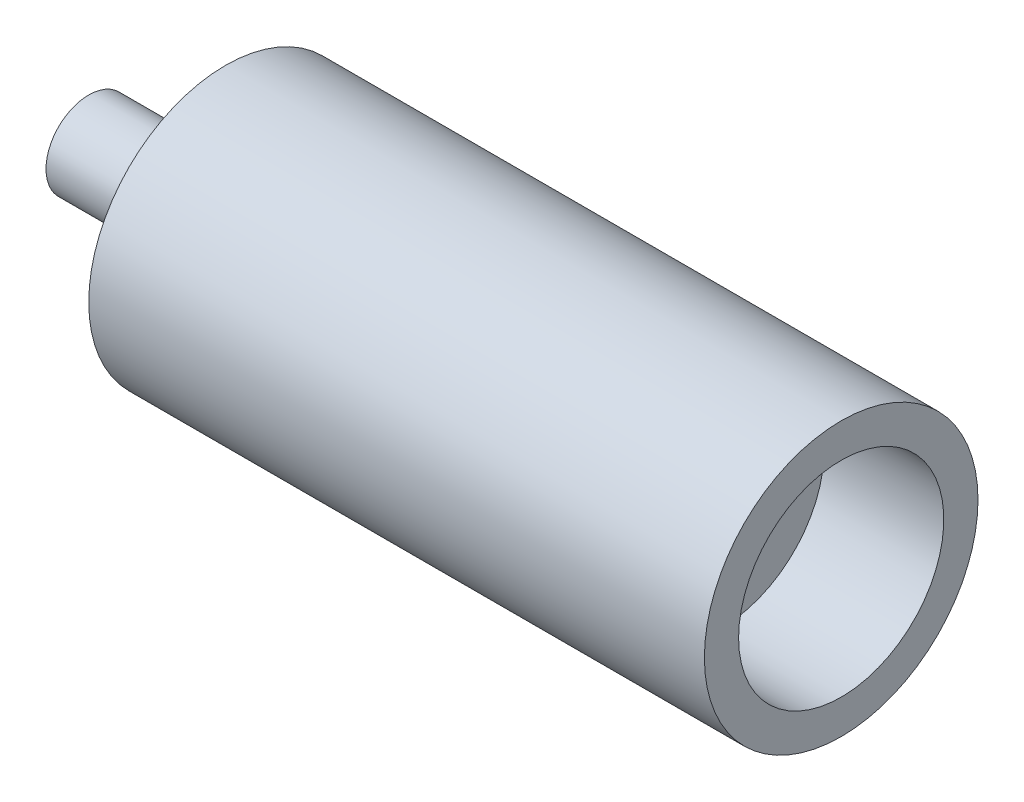
ISO-10303-21;
HEADER;
FILE_DESCRIPTION(('STEP AP214'),'2;1');
FILE_NAME('part.step','',(''),(''),'','','');
FILE_SCHEMA(('AUTOMOTIVE_DESIGN { 1 0 10303 214 1 1 1 1 }'));
ENDSEC;
DATA;
#1=APPLICATION_CONTEXT('core data for automotive mechanical design processes');
#2=APPLICATION_PROTOCOL_DEFINITION('international standard','automotive_design',2000,#1);
#3=PRODUCT_CONTEXT('',#1,'mechanical');
#4=PRODUCT('Part','Part','',(#3));
#5=PRODUCT_RELATED_PRODUCT_CATEGORY('part','',(#4));
#6=PRODUCT_DEFINITION_FORMATION('','',#4);
#7=PRODUCT_DEFINITION_CONTEXT('part definition',#1,'design');
#8=PRODUCT_DEFINITION('design','',#6,#7);
#9=PRODUCT_DEFINITION_SHAPE('','',#8);
#10=(LENGTH_UNIT() NAMED_UNIT(*) SI_UNIT(.MILLI.,.METRE.));
#11=(NAMED_UNIT(*) PLANE_ANGLE_UNIT() SI_UNIT($,.RADIAN.));
#12=(NAMED_UNIT(*) SI_UNIT($,.STERADIAN.) SOLID_ANGLE_UNIT());
#13=UNCERTAINTY_MEASURE_WITH_UNIT(LENGTH_MEASURE(1.E-05),#10,'distance_accuracy_value','');
#14=(GEOMETRIC_REPRESENTATION_CONTEXT(3) GLOBAL_UNCERTAINTY_ASSIGNED_CONTEXT((#13)) GLOBAL_UNIT_ASSIGNED_CONTEXT((#10,
#11,#12)) REPRESENTATION_CONTEXT('',''));
#15=CARTESIAN_POINT('',(0.,0.,0.));
#16=DIRECTION('',(0.,0.,1.));
#17=DIRECTION('',(1.,0.,0.));
#18=AXIS2_PLACEMENT_3D('',#15,#16,#17);
#19=CARTESIAN_POINT('',(0.,0.,0.));
#20=DIRECTION('',(1.,0.,0.));
#21=DIRECTION('',(0.,0.,-1.));
#22=AXIS2_PLACEMENT_3D('',#19,#20,#21);
#23=PLANE('',#22);
#24=CARTESIAN_POINT('',(0.,0.,0.));
#25=DIRECTION('',(-1.,0.,0.));
#26=DIRECTION('',(0.,0.,1.));
#27=AXIS2_PLACEMENT_3D('',#24,#25,#26);
#28=CIRCLE('',#27,12.5);
#29=CARTESIAN_POINT('',(0.,0.,12.5));
#30=VERTEX_POINT('',#29);
#31=EDGE_CURVE('E10',#30,#30,#28,.T.);
#32=ORIENTED_EDGE('',*,*,#31,.T.);
#33=EDGE_LOOP('',(#32));
#34=FACE_BOUND('',#33,.T.);
#35=ADVANCED_FACE('F35',(#34),#23,.F.);
#36=CARTESIAN_POINT('',(37.7600807716813,0.,0.));
#37=DIRECTION('',(-1.,0.,0.));
#38=DIRECTION('',(0.,0.,1.));
#39=AXIS2_PLACEMENT_3D('',#36,#37,#38);
#40=CYLINDRICAL_SURFACE('',#39,12.5);
#41=ORIENTED_EDGE('',*,*,#31,.F.);
#42=EDGE_LOOP('',(#41));
#43=FACE_BOUND('',#42,.T.);
#44=CARTESIAN_POINT('',(30.,0.,0.));
#45=DIRECTION('',(-1.,0.,0.));
#46=DIRECTION('',(0.,0.,1.));
#47=AXIS2_PLACEMENT_3D('',#44,#45,#46);
#48=CIRCLE('',#47,12.5);
#49=CARTESIAN_POINT('',(30.,0.,12.5));
#50=VERTEX_POINT('',#49);
#51=EDGE_CURVE('E41',#50,#50,#48,.T.);
#52=ORIENTED_EDGE('',*,*,#51,.T.);
#53=EDGE_LOOP('',(#52));
#54=FACE_BOUND('',#53,.T.);
#55=ADVANCED_FACE('F88',(#43,#54),#40,.T.);
#56=CARTESIAN_POINT('',(30.,12.5,0.));
#57=DIRECTION('',(1.,0.,0.));
#58=DIRECTION('',(0.,0.,-1.));
#59=AXIS2_PLACEMENT_3D('',#56,#57,#58);
#60=PLANE('',#59);
#61=ORIENTED_EDGE('',*,*,#51,.F.);
#62=EDGE_LOOP('',(#61));
#63=FACE_BOUND('',#62,.T.);
#64=CARTESIAN_POINT('',(30.,0.,0.));
#65=DIRECTION('',(-1.,0.,0.));
#66=DIRECTION('',(0.,0.,1.));
#67=AXIS2_PLACEMENT_3D('',#64,#65,#66);
#68=CIRCLE('',#67,20.);
#69=CARTESIAN_POINT('',(30.,0.,20.));
#70=VERTEX_POINT('',#69);
#71=EDGE_CURVE('E45',#70,#70,#68,.T.);
#72=ORIENTED_EDGE('',*,*,#71,.T.);
#73=EDGE_LOOP('',(#72));
#74=FACE_BOUND('',#73,.T.);
#75=ADVANCED_FACE('F92',(#63,#74),#60,.F.);
#76=CARTESIAN_POINT('',(33.,0.,0.));
#77=DIRECTION('',(1.,0.,0.));
#78=DIRECTION('',(0.,0.,-1.));
#79=AXIS2_PLACEMENT_3D('',#76,#77,#78);
#80=CONICAL_SURFACE('',#79,25.,1.03037682652431);
#81=ORIENTED_EDGE('',*,*,#71,.F.);
#82=EDGE_LOOP('',(#81));
#83=FACE_BOUND('',#82,.T.);
#84=CARTESIAN_POINT('',(33.,0.,0.));
#85=DIRECTION('',(-1.,0.,0.));
#86=DIRECTION('',(0.,0.,1.));
#87=AXIS2_PLACEMENT_3D('',#84,#85,#86);
#88=CIRCLE('',#87,25.);
#89=CARTESIAN_POINT('',(33.,0.,25.));
#90=VERTEX_POINT('',#89);
#91=EDGE_CURVE('E49',#90,#90,#88,.T.);
#92=ORIENTED_EDGE('',*,*,#91,.T.);
#93=EDGE_LOOP('',(#92));
#94=FACE_BOUND('',#93,.T.);
#95=ADVANCED_FACE('F97',(#83,#94),#80,.T.);
#96=CARTESIAN_POINT('',(37.7600807716813,0.,0.));
#97=DIRECTION('',(-1.,0.,0.));
#98=DIRECTION('',(0.,0.,1.));
#99=AXIS2_PLACEMENT_3D('',#96,#97,#98);
#100=CYLINDRICAL_SURFACE('',#99,25.);
#101=ORIENTED_EDGE('',*,*,#91,.F.);
#102=EDGE_LOOP('',(#101));
#103=FACE_BOUND('',#102,.T.);
#104=CARTESIAN_POINT('',(35.,0.,0.));
#105=DIRECTION('',(-1.,0.,0.));
#106=DIRECTION('',(0.,0.,1.));
#107=AXIS2_PLACEMENT_3D('',#104,#105,#106);
#108=CIRCLE('',#107,25.);
#109=CARTESIAN_POINT('',(35.,0.,25.));
#110=VERTEX_POINT('',#109);
#111=EDGE_CURVE('E54',#110,#110,#108,.T.);
#112=ORIENTED_EDGE('',*,*,#111,.T.);
#113=EDGE_LOOP('',(#112));
#114=FACE_BOUND('',#113,.T.);
#115=ADVANCED_FACE('F103',(#103,#114),#100,.T.);
#116=CARTESIAN_POINT('',(35.,25.,0.));
#117=DIRECTION('',(1.,0.,0.));
#118=DIRECTION('',(0.,0.,-1.));
#119=AXIS2_PLACEMENT_3D('',#116,#117,#118);
#120=PLANE('',#119);
#121=ORIENTED_EDGE('',*,*,#111,.F.);
#122=EDGE_LOOP('',(#121));
#123=FACE_BOUND('',#122,.T.);
#124=CARTESIAN_POINT('',(35.,0.,0.));
#125=DIRECTION('',(-1.,0.,0.));
#126=DIRECTION('',(0.,0.,1.));
#127=AXIS2_PLACEMENT_3D('',#124,#125,#126);
#128=CIRCLE('',#127,32.5);
#129=CARTESIAN_POINT('',(35.,0.,32.5));
#130=VERTEX_POINT('',#129);
#131=EDGE_CURVE('E57',#130,#130,#128,.T.);
#132=ORIENTED_EDGE('',*,*,#131,.T.);
#133=EDGE_LOOP('',(#132));
#134=FACE_BOUND('',#133,.T.);
#135=ADVANCED_FACE('F107',(#123,#134),#120,.F.);
#136=CARTESIAN_POINT('',(37.7600807716813,0.,0.));
#137=DIRECTION('',(-1.,0.,0.));
#138=DIRECTION('',(0.,0.,1.));
#139=AXIS2_PLACEMENT_3D('',#136,#137,#138);
#140=CYLINDRICAL_SURFACE('',#139,32.5);
#141=ORIENTED_EDGE('',*,*,#131,.F.);
#142=EDGE_LOOP('',(#141));
#143=FACE_BOUND('',#142,.T.);
#144=CARTESIAN_POINT('',(40.,0.,0.));
#145=DIRECTION('',(-1.,0.,0.));
#146=DIRECTION('',(0.,0.,1.));
#147=AXIS2_PLACEMENT_3D('',#144,#145,#146);
#148=CIRCLE('',#147,32.5);
#149=CARTESIAN_POINT('',(40.,0.,32.5));
#150=VERTEX_POINT('',#149);
#151=EDGE_CURVE('E60',#150,#150,#148,.T.);
#152=ORIENTED_EDGE('',*,*,#151,.T.);
#153=EDGE_LOOP('',(#152));
#154=FACE_BOUND('',#153,.T.);
#155=ADVANCED_FACE('F111',(#143,#154),#140,.T.);
#156=CARTESIAN_POINT('',(40.,32.5,0.));
#157=DIRECTION('',(1.,0.,0.));
#158=DIRECTION('',(0.,0.,-1.));
#159=AXIS2_PLACEMENT_3D('',#156,#157,#158);
#160=PLANE('',#159);
#161=ORIENTED_EDGE('',*,*,#151,.F.);
#162=EDGE_LOOP('',(#161));
#163=FACE_BOUND('',#162,.T.);
#164=CARTESIAN_POINT('',(40.,0.,0.));
#165=DIRECTION('',(-1.,0.,0.));
#166=DIRECTION('',(0.,0.,1.));
#167=AXIS2_PLACEMENT_3D('',#164,#165,#166);
#168=CIRCLE('',#167,40.);
#169=CARTESIAN_POINT('',(40.,0.,40.));
#170=VERTEX_POINT('',#169);
#171=EDGE_CURVE('E63',#170,#170,#168,.T.);
#172=ORIENTED_EDGE('',*,*,#171,.T.);
#173=EDGE_LOOP('',(#172));
#174=FACE_BOUND('',#173,.T.);
#175=ADVANCED_FACE('F115',(#163,#174),#160,.F.);
#176=CARTESIAN_POINT('',(37.7600807716813,0.,0.));
#177=DIRECTION('',(-1.,0.,0.));
#178=DIRECTION('',(0.,0.,1.));
#179=AXIS2_PLACEMENT_3D('',#176,#177,#178);
#180=CYLINDRICAL_SURFACE('',#179,40.);
#181=ORIENTED_EDGE('',*,*,#171,.F.);
#182=EDGE_LOOP('',(#181));
#183=FACE_BOUND('',#182,.T.);
#184=CARTESIAN_POINT('',(220.,0.,0.));
#185=DIRECTION('',(-1.,0.,0.));
#186=DIRECTION('',(0.,0.,1.));
#187=AXIS2_PLACEMENT_3D('',#184,#185,#186);
#188=CIRCLE('',#187,40.);
#189=CARTESIAN_POINT('',(220.,0.,40.));
#190=VERTEX_POINT('',#189);
#191=EDGE_CURVE('E66',#190,#190,#188,.T.);
#192=ORIENTED_EDGE('',*,*,#191,.T.);
#193=EDGE_LOOP('',(#192));
#194=FACE_BOUND('',#193,.T.);
#195=ADVANCED_FACE('F119',(#183,#194),#180,.T.);
#196=CARTESIAN_POINT('',(220.,40.,0.));
#197=DIRECTION('',(-1.,0.,0.));
#198=DIRECTION('',(0.,0.,1.));
#199=AXIS2_PLACEMENT_3D('',#196,#197,#198);
#200=PLANE('',#199);
#201=ORIENTED_EDGE('',*,*,#191,.F.);
#202=EDGE_LOOP('',(#201));
#203=FACE_BOUND('',#202,.T.);
#204=CARTESIAN_POINT('',(220.,0.,0.));
#205=DIRECTION('',(-1.,0.,0.));
#206=DIRECTION('',(0.,0.,1.));
#207=AXIS2_PLACEMENT_3D('',#204,#205,#206);
#208=CIRCLE('',#207,30.);
#209=CARTESIAN_POINT('',(220.,0.,30.));
#210=VERTEX_POINT('',#209);
#211=EDGE_CURVE('E69',#210,#210,#208,.T.);
#212=ORIENTED_EDGE('',*,*,#211,.T.);
#213=EDGE_LOOP('',(#212));
#214=FACE_BOUND('',#213,.T.);
#215=ADVANCED_FACE('F84',(#203,#214),#200,.F.);
#216=CARTESIAN_POINT('',(37.7600807716813,0.,0.));
#217=DIRECTION('',(-1.,0.,0.));
#218=DIRECTION('',(0.,0.,1.));
#219=AXIS2_PLACEMENT_3D('',#216,#217,#218);
#220=CYLINDRICAL_SURFACE('',#219,30.);
#221=ORIENTED_EDGE('',*,*,#211,.F.);
#222=EDGE_LOOP('',(#221));
#223=FACE_BOUND('',#222,.T.);
#224=CARTESIAN_POINT('',(185.,0.,0.));
#225=DIRECTION('',(-1.,0.,0.));
#226=DIRECTION('',(0.,0.,1.));
#227=AXIS2_PLACEMENT_3D('',#224,#225,#226);
#228=CIRCLE('',#227,30.);
#229=CARTESIAN_POINT('',(185.,0.,30.));
#230=VERTEX_POINT('',#229);
#231=EDGE_CURVE('E72',#230,#230,#228,.T.);
#232=ORIENTED_EDGE('',*,*,#231,.T.);
#233=EDGE_LOOP('',(#232));
#234=FACE_BOUND('',#233,.T.);
#235=ADVANCED_FACE('F76',(#223,#234),#220,.F.);
#236=CARTESIAN_POINT('',(185.,30.,0.));
#237=DIRECTION('',(-1.,0.,0.));
#238=DIRECTION('',(0.,0.,1.));
#239=AXIS2_PLACEMENT_3D('',#236,#237,#238);
#240=PLANE('',#239);
#241=ORIENTED_EDGE('',*,*,#231,.F.);
#242=EDGE_LOOP('',(#241));
#243=FACE_BOUND('',#242,.T.);
#244=ADVANCED_FACE('F78',(#243),#240,.F.);
#245=CLOSED_SHELL('',(#35,#55,#75,#95,#115,#135,#155,#175,#195,#215,#235,#244));
#246=MANIFOLD_SOLID_BREP('B2',#245);
#247=ADVANCED_BREP_SHAPE_REPRESENTATION('',(#18,#246),#14);
#248=SHAPE_DEFINITION_REPRESENTATION(#9,#247);
ENDSEC;
END-ISO-10303-21;
